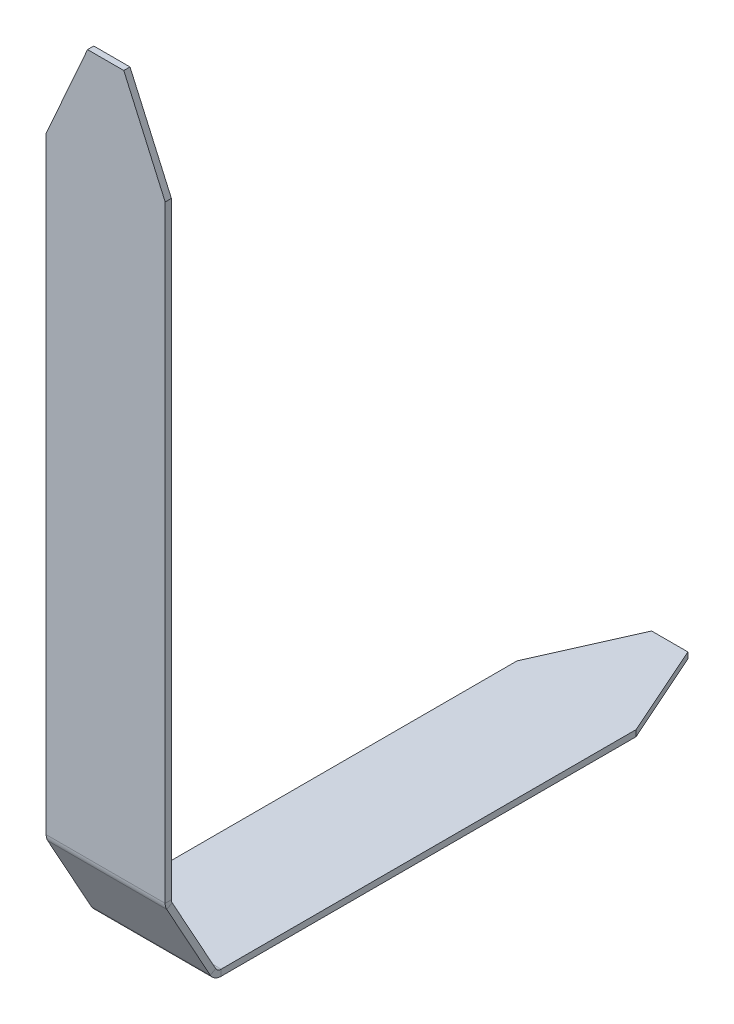
ISO-10303-21;
HEADER;
FILE_DESCRIPTION(('STEP AP214'),'2;1');
FILE_NAME('part.step','',(''),(''),'','','');
FILE_SCHEMA(('AUTOMOTIVE_DESIGN { 1 0 10303 214 1 1 1 1 }'));
ENDSEC;
DATA;
#1=APPLICATION_CONTEXT('core data for automotive mechanical design processes');
#2=APPLICATION_PROTOCOL_DEFINITION('international standard','automotive_design',2000,#1);
#3=PRODUCT_CONTEXT('',#1,'mechanical');
#4=PRODUCT('Part','Part','',(#3));
#5=PRODUCT_RELATED_PRODUCT_CATEGORY('part','',(#4));
#6=PRODUCT_DEFINITION_FORMATION('','',#4);
#7=PRODUCT_DEFINITION_CONTEXT('part definition',#1,'design');
#8=PRODUCT_DEFINITION('design','',#6,#7);
#9=PRODUCT_DEFINITION_SHAPE('','',#8);
#10=(LENGTH_UNIT() NAMED_UNIT(*) SI_UNIT(.MILLI.,.METRE.));
#11=(NAMED_UNIT(*) PLANE_ANGLE_UNIT() SI_UNIT($,.RADIAN.));
#12=(NAMED_UNIT(*) SI_UNIT($,.STERADIAN.) SOLID_ANGLE_UNIT());
#13=UNCERTAINTY_MEASURE_WITH_UNIT(LENGTH_MEASURE(1.E-05),#10,'distance_accuracy_value','');
#14=(GEOMETRIC_REPRESENTATION_CONTEXT(3) GLOBAL_UNCERTAINTY_ASSIGNED_CONTEXT((#13)) GLOBAL_UNIT_ASSIGNED_CONTEXT((#10,
#11,#12)) REPRESENTATION_CONTEXT('',''));
#15=CARTESIAN_POINT('',(0.,0.,0.));
#16=DIRECTION('',(0.,0.,1.));
#17=DIRECTION('',(1.,0.,0.));
#18=AXIS2_PLACEMENT_3D('',#15,#16,#17);
#19=CARTESIAN_POINT('',(57.5,88.096709913031,0.));
#20=DIRECTION('',(1.,0.,0.));
#21=DIRECTION('',(0.,0.,-1.));
#22=AXIS2_PLACEMENT_3D('',#19,#20,#21);
#23=PLANE('',#22);
#24=DIRECTION('',(0.,0.,-1.));
#25=VECTOR('',#24,1.);
#26=CARTESIAN_POINT('',(57.5,88.096709913031,0.));
#27=LINE('',#26,#25);
#28=CARTESIAN_POINT('',(57.5,88.096709913031,0.));
#29=VERTEX_POINT('',#28);
#30=CARTESIAN_POINT('',(57.5,88.096709913031,-6.00000000000001));
#31=VERTEX_POINT('',#30);
#32=EDGE_CURVE('E269',#29,#31,#27,.T.);
#33=ORIENTED_EDGE('',*,*,#32,.F.);
#34=CARTESIAN_POINT('',(57.5,88.096709913031,-12.));
#35=DIRECTION('',(-1.,0.,0.));
#36=DIRECTION('',(0.,0.,1.));
#37=AXIS2_PLACEMENT_3D('',#34,#35,#36);
#38=CIRCLE('',#37,12.);
#39=CARTESIAN_POINT('',(57.5,82.2899861269502,-1.49847825921576));
#40=VERTEX_POINT('',#39);
#41=EDGE_CURVE('E200',#29,#40,#38,.F.);
#42=ORIENTED_EDGE('',*,*,#41,.T.);
#43=DIRECTION('',(0.,-0.483893648840059,0.875126811732022));
#44=VECTOR('',#43,1.);
#45=CARTESIAN_POINT('',(57.5,85.1933480199906,-6.74923912960789));
#46=LINE('',#45,#44);
#47=CARTESIAN_POINT('',(57.5,85.1933480199906,-6.74923912960789));
#48=VERTEX_POINT('',#47);
#49=EDGE_CURVE('E267',#48,#40,#46,.T.);
#50=ORIENTED_EDGE('',*,*,#49,.F.);
#51=CARTESIAN_POINT('',(57.5,88.096709913031,-12.));
#52=DIRECTION('',(1.,0.,0.));
#53=DIRECTION('',(0.,0.,-1.));
#54=AXIS2_PLACEMENT_3D('',#51,#52,#53);
#55=CIRCLE('',#54,6.);
#56=EDGE_CURVE('E190',#31,#48,#55,.T.);
#57=ORIENTED_EDGE('',*,*,#56,.F.);
#58=EDGE_LOOP('',(#33,#42,#50,#57));
#59=FACE_BOUND('',#58,.T.);
#60=ADVANCED_FACE('F38',(#59),#23,.T.);
#61=CARTESIAN_POINT('',(57.5,85.1933480199906,-6.74923912960789));
#62=DIRECTION('',(1.,0.,0.));
#63=DIRECTION('',(0.,0.,-1.));
#64=AXIS2_PLACEMENT_3D('',#61,#62,#63);
#65=PLANE('',#64);
#66=DIRECTION('',(0.,1.,0.));
#67=VECTOR('',#66,1.);
#68=CARTESIAN_POINT('',(57.5,85.,-6.));
#69=LINE('',#68,#67);
#70=CARTESIAN_POINT('',(57.5,675.,-6.));
#71=VERTEX_POINT('',#70);
#72=EDGE_CURVE('E196',#71,#31,#69,.F.);
#73=ORIENTED_EDGE('',*,*,#72,.F.);
#74=DIRECTION('',(0.,0.,1.));
#75=VECTOR('',#74,1.);
#76=CARTESIAN_POINT('',(57.5,675.,-6.74923912960789));
#77=LINE('',#76,#75);
#78=CARTESIAN_POINT('',(57.5,675.,0.));
#79=VERTEX_POINT('',#78);
#80=EDGE_CURVE('E46',#71,#79,#77,.T.);
#81=ORIENTED_EDGE('',*,*,#80,.T.);
#82=DIRECTION('',(0.,-1.,0.));
#83=VECTOR('',#82,1.);
#84=CARTESIAN_POINT('',(57.5,85.,0.));
#85=LINE('',#84,#83);
#86=EDGE_CURVE('E198',#79,#29,#85,.T.);
#87=ORIENTED_EDGE('',*,*,#86,.T.);
#88=ORIENTED_EDGE('',*,*,#32,.T.);
#89=EDGE_LOOP('',(#73,#81,#87,#88));
#90=FACE_BOUND('',#89,.T.);
#91=ADVANCED_FACE('F382',(#90),#65,.T.);
#92=CARTESIAN_POINT('',(-57.5,82.2899861269502,-1.49847825921576));
#93=DIRECTION('',(-1.,0.,0.));
#94=DIRECTION('',(0.,0.,1.));
#95=AXIS2_PLACEMENT_3D('',#92,#93,#94);
#96=PLANE('',#95);
#97=DIRECTION('',(0.,0.483893648840059,-0.875126811732022));
#98=VECTOR('',#97,1.);
#99=CARTESIAN_POINT('',(-57.5,82.2899861269502,-1.49847825921576));
#100=LINE('',#99,#98);
#101=CARTESIAN_POINT('',(-57.5,82.2899861269502,-1.49847825921576));
#102=VERTEX_POINT('',#101);
#103=CARTESIAN_POINT('',(-57.5,85.1933480199906,-6.74923912960789));
#104=VERTEX_POINT('',#103);
#105=EDGE_CURVE('E265',#102,#104,#100,.T.);
#106=ORIENTED_EDGE('',*,*,#105,.F.);
#107=CARTESIAN_POINT('',(-57.5,88.096709913031,-12.));
#108=DIRECTION('',(-1.,0.,0.));
#109=DIRECTION('',(0.,0.,1.));
#110=AXIS2_PLACEMENT_3D('',#107,#108,#109);
#111=CIRCLE('',#110,12.);
#112=CARTESIAN_POINT('',(-57.5,88.096709913031,0.));
#113=VERTEX_POINT('',#112);
#114=EDGE_CURVE('E224',#113,#102,#111,.F.);
#115=ORIENTED_EDGE('',*,*,#114,.F.);
#116=DIRECTION('',(0.,0.,1.));
#117=VECTOR('',#116,1.);
#118=CARTESIAN_POINT('',(-57.5,88.096709913031,-6.00000000000001));
#119=LINE('',#118,#117);
#120=CARTESIAN_POINT('',(-57.5,88.096709913031,-6.00000000000001));
#121=VERTEX_POINT('',#120);
#122=EDGE_CURVE('E262',#121,#113,#119,.T.);
#123=ORIENTED_EDGE('',*,*,#122,.F.);
#124=CARTESIAN_POINT('',(-57.5,88.096709913031,-12.));
#125=DIRECTION('',(1.,0.,0.));
#126=DIRECTION('',(0.,0.,-1.));
#127=AXIS2_PLACEMENT_3D('',#124,#125,#126);
#128=CIRCLE('',#127,6.);
#129=EDGE_CURVE('E217',#121,#104,#128,.T.);
#130=ORIENTED_EDGE('',*,*,#129,.T.);
#131=EDGE_LOOP('',(#106,#115,#123,#130));
#132=FACE_BOUND('',#131,.T.);
#133=ADVANCED_FACE('F331',(#132),#96,.T.);
#134=CARTESIAN_POINT('',(-57.5,88.096709913031,-6.00000000000001));
#135=DIRECTION('',(-1.,0.,0.));
#136=DIRECTION('',(0.,0.,1.));
#137=AXIS2_PLACEMENT_3D('',#134,#135,#136);
#138=PLANE('',#137);
#139=DIRECTION('',(0.,-0.875126811732022,-0.483893648840059));
#140=VECTOR('',#139,1.);
#141=CARTESIAN_POINT('',(-57.5,0.,-47.));
#142=LINE('',#141,#140);
#143=CARTESIAN_POINT('',(-57.5,6.19327621391928,-43.5754825640682));
#144=VERTEX_POINT('',#143);
#145=EDGE_CURVE('E227',#102,#144,#142,.T.);
#146=ORIENTED_EDGE('',*,*,#145,.F.);
#147=ORIENTED_EDGE('',*,*,#105,.T.);
#148=DIRECTION('',(0.,-0.875126811732022,-0.483893648840059));
#149=VECTOR('',#148,1.);
#150=CARTESIAN_POINT('',(-57.5,2.90336189304036,-52.2507608703921));
#151=LINE('',#150,#149);
#152=CARTESIAN_POINT('',(-57.5,9.09663810695965,-48.8262434344603));
#153=VERTEX_POINT('',#152);
#154=EDGE_CURVE('E214',#104,#153,#151,.T.);
#155=ORIENTED_EDGE('',*,*,#154,.T.);
#156=DIRECTION('',(0.,-0.48389364884006,0.875126811732021));
#157=VECTOR('',#156,1.);
#158=CARTESIAN_POINT('',(-57.5,9.09663810695965,-48.8262434344603));
#159=LINE('',#158,#157);
#160=EDGE_CURVE('E258',#153,#144,#159,.T.);
#161=ORIENTED_EDGE('',*,*,#160,.T.);
#162=EDGE_LOOP('',(#146,#147,#155,#161));
#163=FACE_BOUND('',#162,.T.);
#164=ADVANCED_FACE('F335',(#163),#138,.T.);
#165=CARTESIAN_POINT('',(57.5,6.19327621391928,-43.5754825640682));
#166=DIRECTION('',(1.,0.,0.));
#167=DIRECTION('',(0.,0.,-1.));
#168=AXIS2_PLACEMENT_3D('',#165,#166,#167);
#169=PLANE('',#168);
#170=DIRECTION('',(0.,0.48389364884006,-0.875126811732021));
#171=VECTOR('',#170,1.);
#172=CARTESIAN_POINT('',(57.5,6.19327621391928,-43.5754825640682));
#173=LINE('',#172,#171);
#174=CARTESIAN_POINT('',(57.5,6.19327621391928,-43.5754825640682));
#175=VERTEX_POINT('',#174);
#176=CARTESIAN_POINT('',(57.5,9.09663810695965,-48.8262434344603));
#177=VERTEX_POINT('',#176);
#178=EDGE_CURVE('E161',#175,#177,#173,.T.);
#179=ORIENTED_EDGE('',*,*,#178,.F.);
#180=CARTESIAN_POINT('',(57.5,12.,-54.0770043048524));
#181=DIRECTION('',(-1.,0.,0.));
#182=DIRECTION('',(0.,0.,1.));
#183=AXIS2_PLACEMENT_3D('',#180,#181,#182);
#184=CIRCLE('',#183,12.);
#185=CARTESIAN_POINT('',(57.5,0.,-54.0770043048524));
#186=VERTEX_POINT('',#185);
#187=EDGE_CURVE('E156',#175,#186,#184,.F.);
#188=ORIENTED_EDGE('',*,*,#187,.T.);
#189=DIRECTION('',(0.,-1.,0.));
#190=VECTOR('',#189,1.);
#191=CARTESIAN_POINT('',(57.5,6.,-54.0770043048524));
#192=LINE('',#191,#190);
#193=CARTESIAN_POINT('',(57.5,6.,-54.0770043048524));
#194=VERTEX_POINT('',#193);
#195=EDGE_CURVE('E149',#194,#186,#192,.T.);
#196=ORIENTED_EDGE('',*,*,#195,.F.);
#197=CARTESIAN_POINT('',(57.5,12.,-54.0770043048524));
#198=DIRECTION('',(1.,0.,0.));
#199=DIRECTION('',(0.,0.,-1.));
#200=AXIS2_PLACEMENT_3D('',#197,#198,#199);
#201=CIRCLE('',#200,6.);
#202=EDGE_CURVE('E153',#177,#194,#201,.T.);
#203=ORIENTED_EDGE('',*,*,#202,.F.);
#204=EDGE_LOOP('',(#179,#188,#196,#203));
#205=FACE_BOUND('',#204,.T.);
#206=ADVANCED_FACE('F151',(#205),#169,.T.);
#207=CARTESIAN_POINT('',(57.5,6.,-54.0770043048524));
#208=DIRECTION('',(1.,0.,0.));
#209=DIRECTION('',(0.,0.,-1.));
#210=AXIS2_PLACEMENT_3D('',#207,#208,#209);
#211=PLANE('',#210);
#212=DIRECTION('',(0.,-0.875126811732022,-0.483893648840059));
#213=VECTOR('',#212,1.);
#214=CARTESIAN_POINT('',(57.5,0.,-47.));
#215=LINE('',#214,#213);
#216=EDGE_CURVE('E203',#40,#175,#215,.T.);
#217=ORIENTED_EDGE('',*,*,#216,.T.);
#218=ORIENTED_EDGE('',*,*,#178,.T.);
#219=DIRECTION('',(0.,-0.875126811732022,-0.483893648840059));
#220=VECTOR('',#219,1.);
#221=CARTESIAN_POINT('',(57.5,2.90336189304036,-52.2507608703921));
#222=LINE('',#221,#220);
#223=EDGE_CURVE('E188',#48,#177,#222,.T.);
#224=ORIENTED_EDGE('',*,*,#223,.F.);
#225=ORIENTED_EDGE('',*,*,#49,.T.);
#226=EDGE_LOOP('',(#217,#218,#224,#225));
#227=FACE_BOUND('',#226,.T.);
#228=ADVANCED_FACE('F379',(#227),#211,.T.);
#229=CARTESIAN_POINT('',(-57.5,0.,-54.0770043048524));
#230=DIRECTION('',(-1.,0.,0.));
#231=DIRECTION('',(0.,0.,1.));
#232=AXIS2_PLACEMENT_3D('',#229,#230,#231);
#233=PLANE('',#232);
#234=DIRECTION('',(0.,1.,0.));
#235=VECTOR('',#234,1.);
#236=CARTESIAN_POINT('',(-57.5,0.,-54.0770043048524));
#237=LINE('',#236,#235);
#238=CARTESIAN_POINT('',(-57.5,0.,-54.0770043048524));
#239=VERTEX_POINT('',#238);
#240=CARTESIAN_POINT('',(-57.5,6.,-54.0770043048524));
#241=VERTEX_POINT('',#240);
#242=EDGE_CURVE('E162',#239,#241,#237,.T.);
#243=ORIENTED_EDGE('',*,*,#242,.F.);
#244=CARTESIAN_POINT('',(-57.5,12.,-54.0770043048524));
#245=DIRECTION('',(-1.,0.,0.));
#246=DIRECTION('',(0.,0.,1.));
#247=AXIS2_PLACEMENT_3D('',#244,#245,#246);
#248=CIRCLE('',#247,12.);
#249=EDGE_CURVE('E230',#144,#239,#248,.F.);
#250=ORIENTED_EDGE('',*,*,#249,.F.);
#251=ORIENTED_EDGE('',*,*,#160,.F.);
#252=CARTESIAN_POINT('',(-57.5,12.,-54.0770043048524));
#253=DIRECTION('',(1.,0.,0.));
#254=DIRECTION('',(0.,0.,-1.));
#255=AXIS2_PLACEMENT_3D('',#252,#253,#254);
#256=CIRCLE('',#255,6.);
#257=EDGE_CURVE('E212',#153,#241,#256,.T.);
#258=ORIENTED_EDGE('',*,*,#257,.T.);
#259=EDGE_LOOP('',(#243,#250,#251,#258));
#260=FACE_BOUND('',#259,.T.);
#261=ADVANCED_FACE('F346',(#260),#233,.T.);
#262=CARTESIAN_POINT('',(-57.5,9.09663810695965,-48.8262434344603));
#263=DIRECTION('',(-1.,0.,0.));
#264=DIRECTION('',(0.,0.,1.));
#265=AXIS2_PLACEMENT_3D('',#262,#263,#264);
#266=PLANE('',#265);
#267=DIRECTION('',(0.,0.,-1.));
#268=VECTOR('',#267,1.);
#269=CARTESIAN_POINT('',(-57.5,6.,-47.));
#270=LINE('',#269,#268);
#271=CARTESIAN_POINT('',(-57.5,6.,-454.999999999999));
#272=VERTEX_POINT('',#271);
#273=EDGE_CURVE('E173',#241,#272,#270,.T.);
#274=ORIENTED_EDGE('',*,*,#273,.T.);
#275=DIRECTION('',(0.,-1.,0.));
#276=VECTOR('',#275,1.);
#277=CARTESIAN_POINT('',(-57.5,9.09663810695965,-454.999999999999));
#278=LINE('',#277,#276);
#279=CARTESIAN_POINT('',(-57.5,0.,-454.999999999999));
#280=VERTEX_POINT('',#279);
#281=EDGE_CURVE('E272',#272,#280,#278,.T.);
#282=ORIENTED_EDGE('',*,*,#281,.T.);
#283=DIRECTION('',(0.,0.,-1.));
#284=VECTOR('',#283,1.);
#285=CARTESIAN_POINT('',(-57.5,0.,-47.));
#286=LINE('',#285,#284);
#287=EDGE_CURVE('E208',#239,#280,#286,.T.);
#288=ORIENTED_EDGE('',*,*,#287,.F.);
#289=ORIENTED_EDGE('',*,*,#242,.T.);
#290=EDGE_LOOP('',(#274,#282,#288,#289));
#291=FACE_BOUND('',#290,.T.);
#292=ADVANCED_FACE('F371',(#291),#266,.T.);
#293=CARTESIAN_POINT('',(57.5,0.,-47.));
#294=DIRECTION('',(0.,1.,0.));
#295=DIRECTION('',(0.,0.,1.));
#296=AXIS2_PLACEMENT_3D('',#293,#294,#295);
#297=PLANE('',#296);
#298=DIRECTION('',(-1.,0.,0.));
#299=VECTOR('',#298,1.);
#300=CARTESIAN_POINT('',(57.5,0.,-545.));
#301=LINE('',#300,#299);
#302=CARTESIAN_POINT('',(17.5,0.,-545.));
#303=VERTEX_POINT('',#302);
#304=CARTESIAN_POINT('',(-17.5,0.,-545.));
#305=VERTEX_POINT('',#304);
#306=EDGE_CURVE('E256',#303,#305,#301,.T.);
#307=ORIENTED_EDGE('',*,*,#306,.F.);
#308=DIRECTION('',(-0.406138466053446,0.,-0.913811548620258));
#309=VECTOR('',#308,1.);
#310=CARTESIAN_POINT('',(17.5,0.,-545.));
#311=LINE('',#310,#309);
#312=CARTESIAN_POINT('',(57.5,0.,-454.999999999999));
#313=VERTEX_POINT('',#312);
#314=EDGE_CURVE('E297',#303,#313,#311,.F.);
#315=ORIENTED_EDGE('',*,*,#314,.T.);
#316=DIRECTION('',(0.,0.,-1.));
#317=VECTOR('',#316,1.);
#318=CARTESIAN_POINT('',(57.5,0.,-47.));
#319=LINE('',#318,#317);
#320=EDGE_CURVE('E183',#186,#313,#319,.T.);
#321=ORIENTED_EDGE('',*,*,#320,.F.);
#322=DIRECTION('',(-1.,0.,0.));
#323=VECTOR('',#322,1.);
#324=CARTESIAN_POINT('',(57.5,0.,-54.0770043048524));
#325=LINE('',#324,#323);
#326=EDGE_CURVE('E207',#186,#239,#325,.T.);
#327=ORIENTED_EDGE('',*,*,#326,.T.);
#328=ORIENTED_EDGE('',*,*,#287,.T.);
#329=DIRECTION('',(-0.406138466053446,0.,0.913811548620258));
#330=VECTOR('',#329,1.);
#331=CARTESIAN_POINT('',(-57.5,0.,-454.999999999999));
#332=LINE('',#331,#330);
#333=EDGE_CURVE('E275',#280,#305,#332,.F.);
#334=ORIENTED_EDGE('',*,*,#333,.T.);
#335=EDGE_LOOP('',(#307,#315,#321,#327,#328,#334));
#336=FACE_BOUND('',#335,.T.);
#337=ADVANCED_FACE('F358',(#336),#297,.F.);
#338=CARTESIAN_POINT('',(57.5,6.,-545.));
#339=DIRECTION('',(0.,0.,-1.));
#340=DIRECTION('',(-1.,0.,0.));
#341=AXIS2_PLACEMENT_3D('',#338,#339,#340);
#342=PLANE('',#341);
#343=DIRECTION('',(-1.,0.,0.));
#344=VECTOR('',#343,1.);
#345=CARTESIAN_POINT('',(57.5,6.,-545.));
#346=LINE('',#345,#344);
#347=CARTESIAN_POINT('',(17.5,6.,-545.));
#348=VERTEX_POINT('',#347);
#349=CARTESIAN_POINT('',(-17.5,6.,-545.));
#350=VERTEX_POINT('',#349);
#351=EDGE_CURVE('E177',#348,#350,#346,.T.);
#352=ORIENTED_EDGE('',*,*,#351,.F.);
#353=DIRECTION('',(0.,-1.,0.));
#354=VECTOR('',#353,1.);
#355=CARTESIAN_POINT('',(17.5,6.,-545.));
#356=LINE('',#355,#354);
#357=EDGE_CURVE('E294',#348,#303,#356,.T.);
#358=ORIENTED_EDGE('',*,*,#357,.T.);
#359=ORIENTED_EDGE('',*,*,#306,.T.);
#360=DIRECTION('',(0.,1.,0.));
#361=VECTOR('',#360,1.);
#362=CARTESIAN_POINT('',(-17.5,6.,-545.));
#363=LINE('',#362,#361);
#364=EDGE_CURVE('E278',#305,#350,#363,.T.);
#365=ORIENTED_EDGE('',*,*,#364,.T.);
#366=EDGE_LOOP('',(#352,#358,#359,#365));
#367=FACE_BOUND('',#366,.T.);
#368=ADVANCED_FACE('F364',(#367),#342,.T.);
#369=CARTESIAN_POINT('',(57.5,6.,-47.));
#370=DIRECTION('',(0.,1.,0.));
#371=DIRECTION('',(0.,0.,1.));
#372=AXIS2_PLACEMENT_3D('',#369,#370,#371);
#373=PLANE('',#372);
#374=DIRECTION('',(0.,0.,-1.));
#375=VECTOR('',#374,1.);
#376=CARTESIAN_POINT('',(57.5,6.,-47.));
#377=LINE('',#376,#375);
#378=CARTESIAN_POINT('',(57.5,6.,-454.999999999999));
#379=VERTEX_POINT('',#378);
#380=EDGE_CURVE('E170',#194,#379,#377,.T.);
#381=ORIENTED_EDGE('',*,*,#380,.T.);
#382=DIRECTION('',(0.406138466053446,0.,0.913811548620258));
#383=VECTOR('',#382,1.);
#384=CARTESIAN_POINT('',(208.92268041237,6.,-114.298969072164));
#385=LINE('',#384,#383);
#386=EDGE_CURVE('E300',#379,#348,#385,.F.);
#387=ORIENTED_EDGE('',*,*,#386,.T.);
#388=ORIENTED_EDGE('',*,*,#351,.T.);
#389=DIRECTION('',(0.406138466053446,0.,-0.913811548620258));
#390=VECTOR('',#389,1.);
#391=CARTESIAN_POINT('',(-189.953608247422,6.,-156.979381443298));
#392=LINE('',#391,#390);
#393=EDGE_CURVE('E281',#350,#272,#392,.F.);
#394=ORIENTED_EDGE('',*,*,#393,.T.);
#395=ORIENTED_EDGE('',*,*,#273,.F.);
#396=DIRECTION('',(-1.,0.,0.));
#397=VECTOR('',#396,1.);
#398=CARTESIAN_POINT('',(57.5,6.,-54.0770043048524));
#399=LINE('',#398,#397);
#400=EDGE_CURVE('E168',#194,#241,#399,.T.);
#401=ORIENTED_EDGE('',*,*,#400,.F.);
#402=EDGE_LOOP('',(#381,#387,#388,#394,#395,#401));
#403=FACE_BOUND('',#402,.T.);
#404=ADVANCED_FACE('F169',(#403),#373,.T.);
#405=CARTESIAN_POINT('',(57.5,12.,-54.0770043048524));
#406=DIRECTION('',(-1.,0.,0.));
#407=DIRECTION('',(0.,0.,1.));
#408=AXIS2_PLACEMENT_3D('',#405,#406,#407);
#409=CYLINDRICAL_SURFACE('',#408,6.);
#410=ORIENTED_EDGE('',*,*,#257,.F.);
#411=DIRECTION('',(-1.,0.,0.));
#412=VECTOR('',#411,1.);
#413=CARTESIAN_POINT('',(57.5,9.09663810695965,-48.8262434344603));
#414=LINE('',#413,#412);
#415=EDGE_CURVE('E178',#177,#153,#414,.T.);
#416=ORIENTED_EDGE('',*,*,#415,.F.);
#417=ORIENTED_EDGE('',*,*,#202,.T.);
#418=ORIENTED_EDGE('',*,*,#400,.T.);
#419=EDGE_LOOP('',(#410,#416,#417,#418));
#420=FACE_BOUND('',#419,.T.);
#421=ADVANCED_FACE('F186',(#420),#409,.F.);
#422=CARTESIAN_POINT('',(57.5,2.90336189304036,-52.2507608703921));
#423=DIRECTION('',(0.,0.483893648840059,-0.875126811732022));
#424=DIRECTION('',(0.,0.875126811732022,0.483893648840059));
#425=AXIS2_PLACEMENT_3D('',#422,#423,#424);
#426=PLANE('',#425);
#427=ORIENTED_EDGE('',*,*,#154,.F.);
#428=DIRECTION('',(-1.,0.,0.));
#429=VECTOR('',#428,1.);
#430=CARTESIAN_POINT('',(57.5,85.1933480199906,-6.74923912960789));
#431=LINE('',#430,#429);
#432=EDGE_CURVE('E251',#48,#104,#431,.T.);
#433=ORIENTED_EDGE('',*,*,#432,.F.);
#434=ORIENTED_EDGE('',*,*,#223,.T.);
#435=ORIENTED_EDGE('',*,*,#415,.T.);
#436=EDGE_LOOP('',(#427,#433,#434,#435));
#437=FACE_BOUND('',#436,.T.);
#438=ADVANCED_FACE('F344',(#437),#426,.T.);
#439=CARTESIAN_POINT('',(57.5,88.096709913031,-12.));
#440=DIRECTION('',(-1.,0.,0.));
#441=DIRECTION('',(0.,0.,1.));
#442=AXIS2_PLACEMENT_3D('',#439,#440,#441);
#443=CYLINDRICAL_SURFACE('',#442,6.);
#444=ORIENTED_EDGE('',*,*,#129,.F.);
#445=DIRECTION('',(-1.,0.,0.));
#446=VECTOR('',#445,1.);
#447=CARTESIAN_POINT('',(57.5,88.096709913031,-6.00000000000001));
#448=LINE('',#447,#446);
#449=EDGE_CURVE('E248',#31,#121,#448,.T.);
#450=ORIENTED_EDGE('',*,*,#449,.F.);
#451=ORIENTED_EDGE('',*,*,#56,.T.);
#452=ORIENTED_EDGE('',*,*,#432,.T.);
#453=EDGE_LOOP('',(#444,#450,#451,#452));
#454=FACE_BOUND('',#453,.T.);
#455=ADVANCED_FACE('F339',(#454),#443,.F.);
#456=CARTESIAN_POINT('',(57.5,85.,-6.));
#457=DIRECTION('',(0.,0.,-1.));
#458=DIRECTION('',(-1.,0.,0.));
#459=AXIS2_PLACEMENT_3D('',#456,#457,#458);
#460=PLANE('',#459);
#461=DIRECTION('',(-1.,0.,0.));
#462=VECTOR('',#461,1.);
#463=CARTESIAN_POINT('',(57.5,765.,-6.));
#464=LINE('',#463,#462);
#465=CARTESIAN_POINT('',(17.5,765.,-6.));
#466=VERTEX_POINT('',#465);
#467=CARTESIAN_POINT('',(-17.4999999999999,765.,-6.));
#468=VERTEX_POINT('',#467);
#469=EDGE_CURVE('E246',#466,#468,#464,.T.);
#470=ORIENTED_EDGE('',*,*,#469,.F.);
#471=DIRECTION('',(-0.406138466053446,0.913811548620258,0.));
#472=VECTOR('',#471,1.);
#473=CARTESIAN_POINT('',(276.469072164947,182.319587628865,-6.));
#474=LINE('',#473,#472);
#475=EDGE_CURVE('E60',#466,#71,#474,.F.);
#476=ORIENTED_EDGE('',*,*,#475,.T.);
#477=ORIENTED_EDGE('',*,*,#72,.T.);
#478=ORIENTED_EDGE('',*,*,#449,.T.);
#479=DIRECTION('',(0.,1.,0.));
#480=VECTOR('',#479,1.);
#481=CARTESIAN_POINT('',(-57.5,85.,-6.));
#482=LINE('',#481,#480);
#483=CARTESIAN_POINT('',(-57.5,674.999999999999,-6.));
#484=VERTEX_POINT('',#483);
#485=EDGE_CURVE('E220',#484,#121,#482,.F.);
#486=ORIENTED_EDGE('',*,*,#485,.F.);
#487=DIRECTION('',(0.406138466053446,0.913811548620258,0.));
#488=VECTOR('',#487,1.);
#489=CARTESIAN_POINT('',(-257.499999999999,224.999999999999,-6.));
#490=LINE('',#489,#488);
#491=EDGE_CURVE('E286',#484,#468,#490,.T.);
#492=ORIENTED_EDGE('',*,*,#491,.T.);
#493=EDGE_LOOP('',(#470,#476,#477,#478,#486,#492));
#494=FACE_BOUND('',#493,.T.);
#495=ADVANCED_FACE('F311',(#494),#460,.T.);
#496=CARTESIAN_POINT('',(57.5,765.,0.));
#497=DIRECTION('',(0.,1.,0.));
#498=DIRECTION('',(0.,0.,1.));
#499=AXIS2_PLACEMENT_3D('',#496,#497,#498);
#500=PLANE('',#499);
#501=DIRECTION('',(-1.,0.,0.));
#502=VECTOR('',#501,1.);
#503=CARTESIAN_POINT('',(57.5,765.,0.));
#504=LINE('',#503,#502);
#505=CARTESIAN_POINT('',(17.5,765.,0.));
#506=VERTEX_POINT('',#505);
#507=CARTESIAN_POINT('',(-17.4999999999999,765.,0.));
#508=VERTEX_POINT('',#507);
#509=EDGE_CURVE('E244',#506,#508,#504,.T.);
#510=ORIENTED_EDGE('',*,*,#509,.F.);
#511=DIRECTION('',(0.,0.,-1.));
#512=VECTOR('',#511,1.);
#513=CARTESIAN_POINT('',(17.5,765.,0.));
#514=LINE('',#513,#512);
#515=EDGE_CURVE('E302',#506,#466,#514,.T.);
#516=ORIENTED_EDGE('',*,*,#515,.T.);
#517=ORIENTED_EDGE('',*,*,#469,.T.);
#518=DIRECTION('',(0.,0.,1.));
#519=VECTOR('',#518,1.);
#520=CARTESIAN_POINT('',(-17.4999999999999,765.,0.));
#521=LINE('',#520,#519);
#522=EDGE_CURVE('E289',#468,#508,#521,.T.);
#523=ORIENTED_EDGE('',*,*,#522,.T.);
#524=EDGE_LOOP('',(#510,#516,#517,#523));
#525=FACE_BOUND('',#524,.T.);
#526=ADVANCED_FACE('F308',(#525),#500,.T.);
#527=CARTESIAN_POINT('',(57.5,85.,0.));
#528=DIRECTION('',(0.,0.,-1.));
#529=DIRECTION('',(-1.,0.,0.));
#530=AXIS2_PLACEMENT_3D('',#527,#528,#529);
#531=PLANE('',#530);
#532=ORIENTED_EDGE('',*,*,#86,.F.);
#533=DIRECTION('',(0.406138466053446,-0.913811548620258,0.));
#534=VECTOR('',#533,1.);
#535=CARTESIAN_POINT('',(17.5,765.,0.));
#536=LINE('',#535,#534);
#537=EDGE_CURVE('E11',#79,#506,#536,.F.);
#538=ORIENTED_EDGE('',*,*,#537,.T.);
#539=ORIENTED_EDGE('',*,*,#509,.T.);
#540=DIRECTION('',(-0.406138466053446,-0.913811548620258,0.));
#541=VECTOR('',#540,1.);
#542=CARTESIAN_POINT('',(-57.5,674.999999999999,0.));
#543=LINE('',#542,#541);
#544=CARTESIAN_POINT('',(-57.5,674.999999999999,0.));
#545=VERTEX_POINT('',#544);
#546=EDGE_CURVE('E292',#508,#545,#543,.T.);
#547=ORIENTED_EDGE('',*,*,#546,.T.);
#548=DIRECTION('',(0.,-1.,0.));
#549=VECTOR('',#548,1.);
#550=CARTESIAN_POINT('',(-57.5,85.,0.));
#551=LINE('',#550,#549);
#552=EDGE_CURVE('E222',#545,#113,#551,.T.);
#553=ORIENTED_EDGE('',*,*,#552,.T.);
#554=DIRECTION('',(-1.,0.,0.));
#555=VECTOR('',#554,1.);
#556=CARTESIAN_POINT('',(57.5,88.096709913031,0.));
#557=LINE('',#556,#555);
#558=EDGE_CURVE('E241',#29,#113,#557,.T.);
#559=ORIENTED_EDGE('',*,*,#558,.F.);
#560=EDGE_LOOP('',(#532,#538,#539,#547,#553,#559));
#561=FACE_BOUND('',#560,.T.);
#562=ADVANCED_FACE('F320',(#561),#531,.F.);
#563=CARTESIAN_POINT('',(57.5,88.096709913031,-12.));
#564=DIRECTION('',(-1.,0.,0.));
#565=DIRECTION('',(0.,0.,1.));
#566=AXIS2_PLACEMENT_3D('',#563,#564,#565);
#567=CYLINDRICAL_SURFACE('',#566,12.);
#568=ORIENTED_EDGE('',*,*,#114,.T.);
#569=DIRECTION('',(-1.,0.,0.));
#570=VECTOR('',#569,1.);
#571=CARTESIAN_POINT('',(57.5,82.2899861269502,-1.49847825921576));
#572=LINE('',#571,#570);
#573=EDGE_CURVE('E238',#40,#102,#572,.T.);
#574=ORIENTED_EDGE('',*,*,#573,.F.);
#575=ORIENTED_EDGE('',*,*,#41,.F.);
#576=ORIENTED_EDGE('',*,*,#558,.T.);
#577=EDGE_LOOP('',(#568,#574,#575,#576));
#578=FACE_BOUND('',#577,.T.);
#579=ADVANCED_FACE('F329',(#578),#567,.T.);
#580=CARTESIAN_POINT('',(57.5,0.,-47.));
#581=DIRECTION('',(0.,0.483893648840059,-0.875126811732022));
#582=DIRECTION('',(0.,0.875126811732022,0.483893648840059));
#583=AXIS2_PLACEMENT_3D('',#580,#581,#582);
#584=PLANE('',#583);
#585=ORIENTED_EDGE('',*,*,#145,.T.);
#586=DIRECTION('',(-1.,0.,0.));
#587=VECTOR('',#586,1.);
#588=CARTESIAN_POINT('',(57.5,6.19327621391928,-43.5754825640682));
#589=LINE('',#588,#587);
#590=EDGE_CURVE('E235',#175,#144,#589,.T.);
#591=ORIENTED_EDGE('',*,*,#590,.F.);
#592=ORIENTED_EDGE('',*,*,#216,.F.);
#593=ORIENTED_EDGE('',*,*,#573,.T.);
#594=EDGE_LOOP('',(#585,#591,#592,#593));
#595=FACE_BOUND('',#594,.T.);
#596=ADVANCED_FACE('F350',(#595),#584,.F.);
#597=CARTESIAN_POINT('',(57.5,12.,-54.0770043048524));
#598=DIRECTION('',(-1.,0.,0.));
#599=DIRECTION('',(0.,0.,1.));
#600=AXIS2_PLACEMENT_3D('',#597,#598,#599);
#601=CYLINDRICAL_SURFACE('',#600,12.);
#602=ORIENTED_EDGE('',*,*,#249,.T.);
#603=ORIENTED_EDGE('',*,*,#326,.F.);
#604=ORIENTED_EDGE('',*,*,#187,.F.);
#605=ORIENTED_EDGE('',*,*,#590,.T.);
#606=EDGE_LOOP('',(#602,#603,#604,#605));
#607=FACE_BOUND('',#606,.T.);
#608=ADVANCED_FACE('F353',(#607),#601,.T.);
#609=CARTESIAN_POINT('',(57.5,12.,-54.0770043048524));
#610=DIRECTION('',(1.,0.,0.));
#611=DIRECTION('',(0.,0.,-1.));
#612=AXIS2_PLACEMENT_3D('',#609,#610,#611);
#613=PLANE('',#612);
#614=ORIENTED_EDGE('',*,*,#320,.T.);
#615=DIRECTION('',(0.,1.,0.));
#616=VECTOR('',#615,1.);
#617=CARTESIAN_POINT('',(57.5,12.,-454.999999999999));
#618=LINE('',#617,#616);
#619=EDGE_CURVE('E182',#313,#379,#618,.T.);
#620=ORIENTED_EDGE('',*,*,#619,.T.);
#621=ORIENTED_EDGE('',*,*,#380,.F.);
#622=ORIENTED_EDGE('',*,*,#195,.T.);
#623=EDGE_LOOP('',(#614,#620,#621,#622));
#624=FACE_BOUND('',#623,.T.);
#625=ADVANCED_FACE('F180',(#624),#613,.T.);
#626=CARTESIAN_POINT('',(-57.5,12.,-54.0770043048524));
#627=DIRECTION('',(1.,0.,0.));
#628=DIRECTION('',(0.,0.,-1.));
#629=AXIS2_PLACEMENT_3D('',#626,#627,#628);
#630=PLANE('',#629);
#631=ORIENTED_EDGE('',*,*,#552,.F.);
#632=DIRECTION('',(0.,0.,-1.));
#633=VECTOR('',#632,1.);
#634=CARTESIAN_POINT('',(-57.5,674.999999999999,-6.));
#635=LINE('',#634,#633);
#636=EDGE_CURVE('E283',#545,#484,#635,.T.);
#637=ORIENTED_EDGE('',*,*,#636,.T.);
#638=ORIENTED_EDGE('',*,*,#485,.T.);
#639=ORIENTED_EDGE('',*,*,#122,.T.);
#640=EDGE_LOOP('',(#631,#637,#638,#639));
#641=FACE_BOUND('',#640,.T.);
#642=ADVANCED_FACE('F323',(#641),#630,.F.);
#643=CARTESIAN_POINT('',(-57.5,9.09663810695965,-454.999999999999));
#644=DIRECTION('',(0.913811548620258,0.,0.406138466053445));
#645=DIRECTION('',(0.,-1.,0.));
#646=AXIS2_PLACEMENT_3D('',#643,#644,#645);
#647=PLANE('',#646);
#648=ORIENTED_EDGE('',*,*,#393,.F.);
#649=ORIENTED_EDGE('',*,*,#364,.F.);
#650=ORIENTED_EDGE('',*,*,#333,.F.);
#651=ORIENTED_EDGE('',*,*,#281,.F.);
#652=EDGE_LOOP('',(#648,#649,#650,#651));
#653=FACE_BOUND('',#652,.T.);
#654=ADVANCED_FACE('F369',(#653),#647,.F.);
#655=CARTESIAN_POINT('',(-57.5,674.999999999999,-54.0770043048524));
#656=DIRECTION('',(-0.913811548620258,0.406138466053446,0.));
#657=DIRECTION('',(0.,0.,1.));
#658=AXIS2_PLACEMENT_3D('',#655,#656,#657);
#659=PLANE('',#658);
#660=ORIENTED_EDGE('',*,*,#546,.F.);
#661=ORIENTED_EDGE('',*,*,#522,.F.);
#662=ORIENTED_EDGE('',*,*,#491,.F.);
#663=ORIENTED_EDGE('',*,*,#636,.F.);
#664=EDGE_LOOP('',(#660,#661,#662,#663));
#665=FACE_BOUND('',#664,.T.);
#666=ADVANCED_FACE('F317',(#665),#659,.T.);
#667=CARTESIAN_POINT('',(17.5,6.,-545.));
#668=DIRECTION('',(-0.913811548620258,0.,0.406138466053445));
#669=DIRECTION('',(0.,-1.,0.));
#670=AXIS2_PLACEMENT_3D('',#667,#668,#669);
#671=PLANE('',#670);
#672=ORIENTED_EDGE('',*,*,#386,.F.);
#673=ORIENTED_EDGE('',*,*,#619,.F.);
#674=ORIENTED_EDGE('',*,*,#314,.F.);
#675=ORIENTED_EDGE('',*,*,#357,.F.);
#676=EDGE_LOOP('',(#672,#673,#674,#675));
#677=FACE_BOUND('',#676,.T.);
#678=ADVANCED_FACE('F360',(#677),#671,.F.);
#679=CARTESIAN_POINT('',(17.5,765.,0.));
#680=DIRECTION('',(-0.913811548620258,-0.406138466053445,0.));
#681=DIRECTION('',(0.,0.,-1.));
#682=AXIS2_PLACEMENT_3D('',#679,#680,#681);
#683=PLANE('',#682);
#684=ORIENTED_EDGE('',*,*,#537,.F.);
#685=ORIENTED_EDGE('',*,*,#80,.F.);
#686=ORIENTED_EDGE('',*,*,#475,.F.);
#687=ORIENTED_EDGE('',*,*,#515,.F.);
#688=EDGE_LOOP('',(#684,#685,#686,#687));
#689=FACE_BOUND('',#688,.T.);
#690=ADVANCED_FACE('F40',(#689),#683,.F.);
#691=CLOSED_SHELL('',(#60,#91,#133,#164,#206,#228,#261,#292,#337,#368,#404,#421,#438,#455,#495,
#526,#562,#579,#596,#608,#625,#642,#654,#666,#678,#690));
#692=MANIFOLD_SOLID_BREP('B2',#691);
#693=ADVANCED_BREP_SHAPE_REPRESENTATION('',(#18,#692),#14);
#694=SHAPE_DEFINITION_REPRESENTATION(#9,#693);
ENDSEC;
END-ISO-10303-21;
